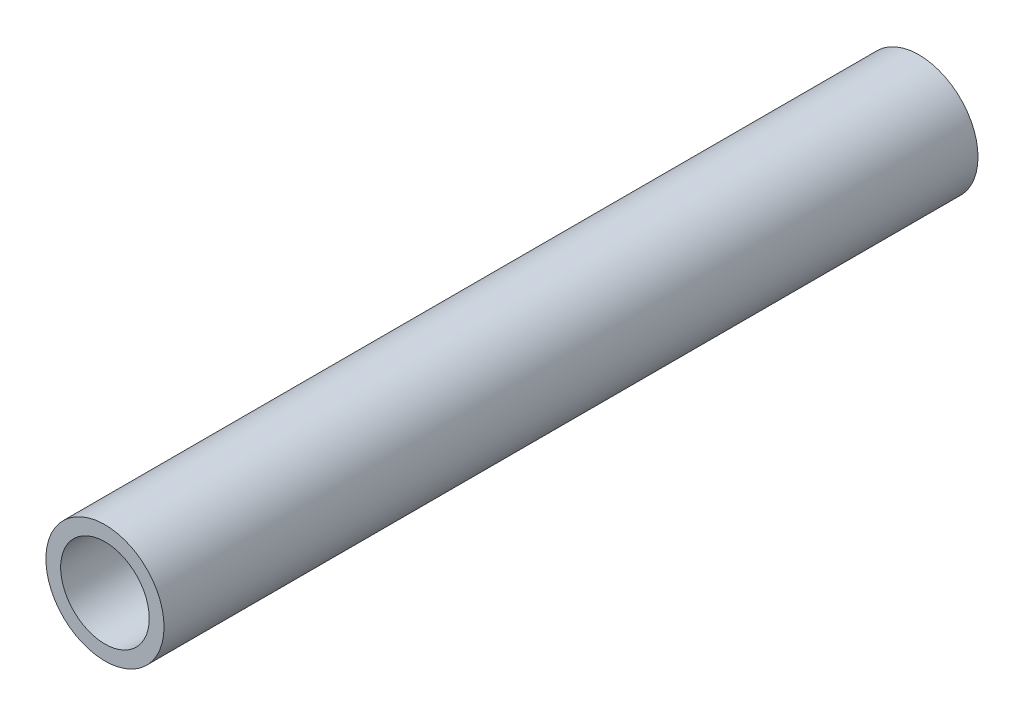
ISO-10303-21;
HEADER;
FILE_DESCRIPTION(('STEP AP214'),'2;1');
FILE_NAME('part.step','',(''),(''),'','','');
FILE_SCHEMA(('AUTOMOTIVE_DESIGN { 1 0 10303 214 1 1 1 1 }'));
ENDSEC;
DATA;
#1=APPLICATION_CONTEXT('core data for automotive mechanical design processes');
#2=APPLICATION_PROTOCOL_DEFINITION('international standard','automotive_design',2000,#1);
#3=PRODUCT_CONTEXT('',#1,'mechanical');
#4=PRODUCT('Part','Part','',(#3));
#5=PRODUCT_RELATED_PRODUCT_CATEGORY('part','',(#4));
#6=PRODUCT_DEFINITION_FORMATION('','',#4);
#7=PRODUCT_DEFINITION_CONTEXT('part definition',#1,'design');
#8=PRODUCT_DEFINITION('design','',#6,#7);
#9=PRODUCT_DEFINITION_SHAPE('','',#8);
#10=(LENGTH_UNIT() NAMED_UNIT(*) SI_UNIT(.MILLI.,.METRE.));
#11=(NAMED_UNIT(*) PLANE_ANGLE_UNIT() SI_UNIT($,.RADIAN.));
#12=(NAMED_UNIT(*) SI_UNIT($,.STERADIAN.) SOLID_ANGLE_UNIT());
#13=UNCERTAINTY_MEASURE_WITH_UNIT(LENGTH_MEASURE(1.E-05),#10,'distance_accuracy_value','');
#14=(GEOMETRIC_REPRESENTATION_CONTEXT(3) GLOBAL_UNCERTAINTY_ASSIGNED_CONTEXT((#13)) GLOBAL_UNIT_ASSIGNED_CONTEXT((#10,
#11,#12)) REPRESENTATION_CONTEXT('',''));
#15=CARTESIAN_POINT('',(0.,0.,0.));
#16=DIRECTION('',(0.,0.,1.));
#17=DIRECTION('',(1.,0.,0.));
#18=AXIS2_PLACEMENT_3D('',#15,#16,#17);
#19=CARTESIAN_POINT('',(0.,0.,7.));
#20=DIRECTION('',(0.,0.,1.));
#21=DIRECTION('',(1.,0.,0.));
#22=AXIS2_PLACEMENT_3D('',#19,#20,#21);
#23=PLANE('',#22);
#24=CARTESIAN_POINT('',(0.,0.,7.));
#25=DIRECTION('',(0.,0.,1.));
#26=DIRECTION('',(1.,0.,0.));
#27=AXIS2_PLACEMENT_3D('',#24,#25,#26);
#28=CIRCLE('',#27,0.508);
#29=CARTESIAN_POINT('',(0.508,0.,7.));
#30=VERTEX_POINT('',#29);
#31=EDGE_CURVE('E10',#30,#30,#28,.T.);
#32=ORIENTED_EDGE('',*,*,#31,.T.);
#33=EDGE_LOOP('',(#32));
#34=FACE_BOUND('',#33,.T.);
#35=CARTESIAN_POINT('',(0.,0.,7.));
#36=DIRECTION('',(0.,0.,1.));
#37=DIRECTION('',(1.,0.,0.));
#38=AXIS2_PLACEMENT_3D('',#35,#36,#37);
#39=CIRCLE('',#38,0.381);
#40=CARTESIAN_POINT('',(0.381,0.,7.));
#41=VERTEX_POINT('',#40);
#42=EDGE_CURVE('E46',#41,#41,#39,.T.);
#43=ORIENTED_EDGE('',*,*,#42,.F.);
#44=EDGE_LOOP('',(#43));
#45=FACE_BOUND('',#44,.T.);
#46=ADVANCED_FACE('F35',(#34,#45),#23,.T.);
#47=CARTESIAN_POINT('',(0.,0.,0.));
#48=DIRECTION('',(0.,0.,1.));
#49=DIRECTION('',(1.,0.,0.));
#50=AXIS2_PLACEMENT_3D('',#47,#48,#49);
#51=PLANE('',#50);
#52=CARTESIAN_POINT('',(0.,0.,0.));
#53=DIRECTION('',(0.,0.,1.));
#54=DIRECTION('',(1.,0.,0.));
#55=AXIS2_PLACEMENT_3D('',#52,#53,#54);
#56=CIRCLE('',#55,0.508);
#57=CARTESIAN_POINT('',(0.508,0.,0.));
#58=VERTEX_POINT('',#57);
#59=EDGE_CURVE('E39',#58,#58,#56,.T.);
#60=ORIENTED_EDGE('',*,*,#59,.F.);
#61=EDGE_LOOP('',(#60));
#62=FACE_BOUND('',#61,.T.);
#63=CARTESIAN_POINT('',(0.,0.,0.));
#64=DIRECTION('',(0.,0.,1.));
#65=DIRECTION('',(1.,0.,0.));
#66=AXIS2_PLACEMENT_3D('',#63,#64,#65);
#67=CIRCLE('',#66,0.381);
#68=CARTESIAN_POINT('',(0.381,0.,0.));
#69=VERTEX_POINT('',#68);
#70=EDGE_CURVE('E48',#69,#69,#67,.T.);
#71=ORIENTED_EDGE('',*,*,#70,.T.);
#72=EDGE_LOOP('',(#71));
#73=FACE_BOUND('',#72,.T.);
#74=ADVANCED_FACE('F58',(#62,#73),#51,.F.);
#75=CARTESIAN_POINT('',(0.,0.,7.));
#76=DIRECTION('',(0.,0.,-1.));
#77=DIRECTION('',(-1.,0.,0.));
#78=AXIS2_PLACEMENT_3D('',#75,#76,#77);
#79=CYLINDRICAL_SURFACE('',#78,0.508);
#80=ORIENTED_EDGE('',*,*,#31,.F.);
#81=EDGE_LOOP('',(#80));
#82=FACE_BOUND('',#81,.T.);
#83=ORIENTED_EDGE('',*,*,#59,.T.);
#84=EDGE_LOOP('',(#83));
#85=FACE_BOUND('',#84,.T.);
#86=ADVANCED_FACE('F37',(#82,#85),#79,.T.);
#87=CARTESIAN_POINT('',(0.,0.,7.));
#88=DIRECTION('',(0.,0.,-1.));
#89=DIRECTION('',(-1.,0.,0.));
#90=AXIS2_PLACEMENT_3D('',#87,#88,#89);
#91=CYLINDRICAL_SURFACE('',#90,0.381);
#92=ORIENTED_EDGE('',*,*,#42,.T.);
#93=EDGE_LOOP('',(#92));
#94=FACE_BOUND('',#93,.T.);
#95=ORIENTED_EDGE('',*,*,#70,.F.);
#96=EDGE_LOOP('',(#95));
#97=FACE_BOUND('',#96,.T.);
#98=ADVANCED_FACE('F54',(#94,#97),#91,.F.);
#99=CLOSED_SHELL('',(#46,#74,#86,#98));
#100=MANIFOLD_SOLID_BREP('B2',#99);
#101=ADVANCED_BREP_SHAPE_REPRESENTATION('',(#18,#100),#14);
#102=SHAPE_DEFINITION_REPRESENTATION(#9,#101);
ENDSEC;
END-ISO-10303-21;
